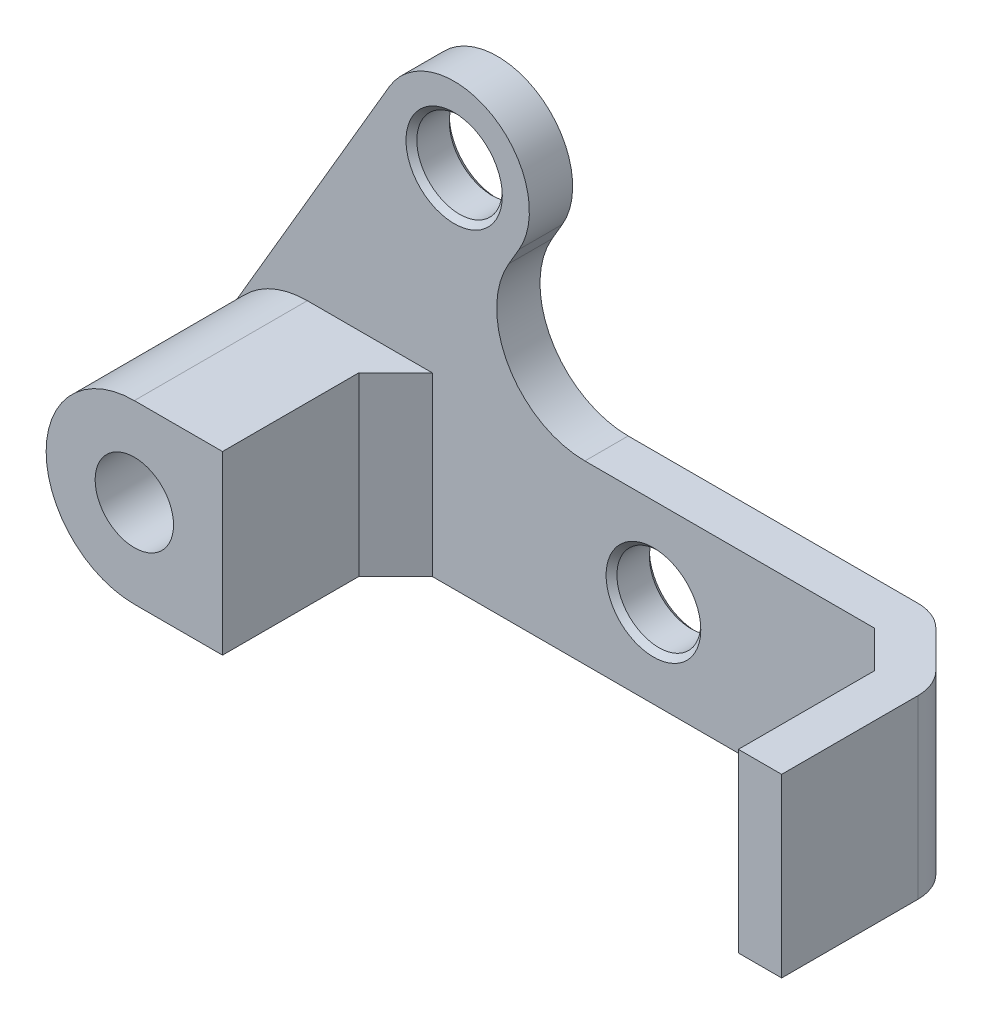
ISO-10303-21;
HEADER;
FILE_DESCRIPTION(('STEP AP214'),'2;1');
FILE_NAME('part.step','',(''),(''),'','','');
FILE_SCHEMA(('AUTOMOTIVE_DESIGN { 1 0 10303 214 1 1 1 1 }'));
ENDSEC;
DATA;
#1=APPLICATION_CONTEXT('core data for automotive mechanical design processes');
#2=APPLICATION_PROTOCOL_DEFINITION('international standard','automotive_design',2000,#1);
#3=PRODUCT_CONTEXT('',#1,'mechanical');
#4=PRODUCT('Part','Part','',(#3));
#5=PRODUCT_RELATED_PRODUCT_CATEGORY('part','',(#4));
#6=PRODUCT_DEFINITION_FORMATION('','',#4);
#7=PRODUCT_DEFINITION_CONTEXT('part definition',#1,'design');
#8=PRODUCT_DEFINITION('design','',#6,#7);
#9=PRODUCT_DEFINITION_SHAPE('','',#8);
#10=(LENGTH_UNIT() NAMED_UNIT(*) SI_UNIT(.MILLI.,.METRE.));
#11=(NAMED_UNIT(*) PLANE_ANGLE_UNIT() SI_UNIT($,.RADIAN.));
#12=(NAMED_UNIT(*) SI_UNIT($,.STERADIAN.) SOLID_ANGLE_UNIT());
#13=UNCERTAINTY_MEASURE_WITH_UNIT(LENGTH_MEASURE(1.E-05),#10,'distance_accuracy_value','');
#14=(GEOMETRIC_REPRESENTATION_CONTEXT(3) GLOBAL_UNCERTAINTY_ASSIGNED_CONTEXT((#13)) GLOBAL_UNIT_ASSIGNED_CONTEXT((#10,
#11,#12)) REPRESENTATION_CONTEXT('',''));
#15=CARTESIAN_POINT('',(0.,0.,0.));
#16=DIRECTION('',(0.,0.,1.));
#17=DIRECTION('',(1.,0.,0.));
#18=AXIS2_PLACEMENT_3D('',#15,#16,#17);
#19=CARTESIAN_POINT('',(86.3209999999999,39.3505000000001,0.));
#20=DIRECTION('',(0.,1.,0.));
#21=DIRECTION('',(-1.,0.,0.));
#22=AXIS2_PLACEMENT_3D('',#19,#20,#21);
#23=PLANE('',#22);
#24=DIRECTION('',(-1.,0.,0.));
#25=VECTOR('',#24,1.);
#26=CARTESIAN_POINT('',(86.3209999999999,39.3505000000001,25.3840000000001));
#27=LINE('',#26,#25);
#28=CARTESIAN_POINT('',(86.3209999999999,39.3505000000001,25.3840000000001));
#29=VERTEX_POINT('',#28);
#30=CARTESIAN_POINT('',(81.2409999999999,39.3505000000001,25.3840000000001));
#31=VERTEX_POINT('',#30);
#32=EDGE_CURVE('E193',#29,#31,#27,.T.);
#33=ORIENTED_EDGE('',*,*,#32,.F.);
#34=DIRECTION('',(0.,0.,1.));
#35=VECTOR('',#34,1.);
#36=CARTESIAN_POINT('',(86.3210000000002,39.3505000000001,0.));
#37=LINE('',#36,#35);
#38=CARTESIAN_POINT('',(86.3210000000002,39.3505000000001,9.39052293811297));
#39=VERTEX_POINT('',#38);
#40=EDGE_CURVE('E192',#29,#39,#37,.F.);
#41=ORIENTED_EDGE('',*,*,#40,.T.);
#42=CARTESIAN_POINT('',(81.2409999999999,39.3505000000001,9.39052293811297));
#43=DIRECTION('',(0.,1.,0.));
#44=DIRECTION('',(-1.,0.,0.));
#45=AXIS2_PLACEMENT_3D('',#42,#43,#44);
#46=CIRCLE('',#45,5.08);
#47=CARTESIAN_POINT('',(84.8331024484276,39.3505000000001,5.79842048968529));
#48=VERTEX_POINT('',#47);
#49=EDGE_CURVE('E813',#39,#48,#46,.T.);
#50=ORIENTED_EDGE('',*,*,#49,.T.);
#51=DIRECTION('',(-0.707106781186567,0.,-0.707106781186528));
#52=VECTOR('',#51,1.);
#53=CARTESIAN_POINT('',(84.8331024484278,39.3505000000001,5.79842048968551));
#54=LINE('',#53,#52);
#55=CARTESIAN_POINT('',(80.5225795103145,39.3505000000001,1.48789755157245));
#56=VERTEX_POINT('',#55);
#57=EDGE_CURVE('E361',#48,#56,#54,.T.);
#58=ORIENTED_EDGE('',*,*,#57,.T.);
#59=CARTESIAN_POINT('',(76.930477061887,39.3505000000001,5.08));
#60=DIRECTION('',(0.,1.,0.));
#61=DIRECTION('',(-1.,0.,0.));
#62=AXIS2_PLACEMENT_3D('',#59,#60,#61);
#63=CIRCLE('',#62,5.08);
#64=CARTESIAN_POINT('',(76.930477061887,39.3505000000001,0.));
#65=VERTEX_POINT('',#64);
#66=EDGE_CURVE('E733',#56,#65,#63,.T.);
#67=ORIENTED_EDGE('',*,*,#66,.T.);
#68=DIRECTION('',(1.,0.,0.));
#69=VECTOR('',#68,1.);
#70=CARTESIAN_POINT('',(43.1605000000001,39.3505000000001,0.));
#71=LINE('',#70,#69);
#72=CARTESIAN_POINT('',(42.9251677598156,39.3505000000001,0.));
#73=VERTEX_POINT('',#72);
#74=EDGE_CURVE('E215',#65,#73,#71,.F.);
#75=ORIENTED_EDGE('',*,*,#74,.T.);
#76=DIRECTION('',(0.,0.,1.));
#77=VECTOR('',#76,1.);
#78=CARTESIAN_POINT('',(42.9251677598156,39.3505000000001,0.));
#79=LINE('',#78,#77);
#80=CARTESIAN_POINT('',(42.9251677598156,39.3505000000001,5.08));
#81=VERTEX_POINT('',#80);
#82=EDGE_CURVE('E354',#73,#81,#79,.T.);
#83=ORIENTED_EDGE('',*,*,#82,.T.);
#84=DIRECTION('',(-1.,0.,0.));
#85=VECTOR('',#84,1.);
#86=CARTESIAN_POINT('',(86.3209999999999,39.3505000000001,5.08));
#87=LINE('',#86,#85);
#88=CARTESIAN_POINT('',(76.9304770618867,39.3505000000001,5.08));
#89=VERTEX_POINT('',#88);
#90=EDGE_CURVE('E360',#81,#89,#87,.F.);
#91=ORIENTED_EDGE('',*,*,#90,.T.);
#92=DIRECTION('',(-0.707106781186539,0.,-0.707106781186556));
#93=VECTOR('',#92,1.);
#94=CARTESIAN_POINT('',(81.2409999999999,39.3505000000001,9.39052293811325));
#95=LINE('',#94,#93);
#96=CARTESIAN_POINT('',(81.2409999999999,39.3505000000001,9.39052293811325));
#97=VERTEX_POINT('',#96);
#98=EDGE_CURVE('E805',#89,#97,#95,.F.);
#99=ORIENTED_EDGE('',*,*,#98,.T.);
#100=DIRECTION('',(0.,0.,1.));
#101=VECTOR('',#100,1.);
#102=CARTESIAN_POINT('',(81.2409999999999,39.3505000000001,0.));
#103=LINE('',#102,#101);
#104=EDGE_CURVE('E588',#97,#31,#103,.T.);
#105=ORIENTED_EDGE('',*,*,#104,.T.);
#106=EDGE_LOOP('',(#33,#41,#50,#58,#67,#75,#83,#91,#99,#105));
#107=FACE_BOUND('',#106,.T.);
#108=ADVANCED_FACE('F50',(#107),#23,.T.);
#109=CARTESIAN_POINT('',(43.1605000000001,29.0000000000001,0.));
#110=DIRECTION('',(0.,0.,1.));
#111=DIRECTION('',(1.,0.,0.));
#112=AXIS2_PLACEMENT_3D('',#109,#110,#111);
#113=PLANE('',#112);
#114=CARTESIAN_POINT('',(10.3505,29.0000000000001,0.));
#115=DIRECTION('',(0.,0.,1.));
#116=DIRECTION('',(1.,0.,0.));
#117=AXIS2_PLACEMENT_3D('',#114,#115,#116);
#118=CIRCLE('',#117,7.17549999999999);
#119=CARTESIAN_POINT('',(17.526,29.0000000000001,0.));
#120=VERTEX_POINT('',#119);
#121=EDGE_CURVE('E538',#120,#120,#118,.T.);
#122=ORIENTED_EDGE('',*,*,#121,.T.);
#123=EDGE_LOOP('',(#122));
#124=FACE_BOUND('',#123,.T.);
#125=CARTESIAN_POINT('',(27.580941262364,61.4484999999991,0.));
#126=DIRECTION('',(0.,0.,1.));
#127=DIRECTION('',(1.,0.,0.));
#128=AXIS2_PLACEMENT_3D('',#125,#126,#127);
#129=CIRCLE('',#128,5.6514999999844);
#130=CARTESIAN_POINT('',(33.2324412623484,61.4484999999991,0.));
#131=VERTEX_POINT('',#130);
#132=EDGE_CURVE('E531',#131,#131,#129,.T.);
#133=ORIENTED_EDGE('',*,*,#132,.T.);
#134=EDGE_LOOP('',(#133));
#135=FACE_BOUND('',#134,.T.);
#136=CARTESIAN_POINT('',(50.9710000000001,29.0000000000001,0.));
#137=DIRECTION('',(0.,0.,1.));
#138=DIRECTION('',(1.,0.,0.));
#139=AXIS2_PLACEMENT_3D('',#136,#137,#138);
#140=CIRCLE('',#139,5.55624999998435);
#141=CARTESIAN_POINT('',(56.5272499999844,29.0000000000001,0.));
#142=VERTEX_POINT('',#141);
#143=EDGE_CURVE('E527',#142,#142,#140,.T.);
#144=ORIENTED_EDGE('',*,*,#143,.T.);
#145=EDGE_LOOP('',(#144));
#146=FACE_BOUND('',#145,.T.);
#147=ORIENTED_EDGE('',*,*,#74,.F.);
#148=DIRECTION('',(0.,1.,0.));
#149=VECTOR('',#148,1.);
#150=CARTESIAN_POINT('',(76.930477061887,29.0000000000001,0.));
#151=LINE('',#150,#149);
#152=CARTESIAN_POINT('',(76.930477061887,18.6495,0.));
#153=VERTEX_POINT('',#152);
#154=EDGE_CURVE('E12',#65,#153,#151,.F.);
#155=ORIENTED_EDGE('',*,*,#154,.T.);
#156=DIRECTION('',(1.,0.,0.));
#157=VECTOR('',#156,1.);
#158=CARTESIAN_POINT('',(43.1605000000001,18.6495,0.));
#159=LINE('',#158,#157);
#160=CARTESIAN_POINT('',(10.3505,18.6495,0.));
#161=VERTEX_POINT('',#160);
#162=EDGE_CURVE('E261',#161,#153,#159,.T.);
#163=ORIENTED_EDGE('',*,*,#162,.F.);
#164=CARTESIAN_POINT('',(10.3505,29.0000000000001,0.));
#165=DIRECTION('',(0.,0.,1.));
#166=DIRECTION('',(1.,0.,0.));
#167=AXIS2_PLACEMENT_3D('',#164,#165,#166);
#168=CIRCLE('',#167,10.3505);
#169=CARTESIAN_POINT('',(1.4181269699782,34.2292984522342,0.));
#170=VERTEX_POINT('',#169);
#171=EDGE_CURVE('E259',#170,#161,#168,.T.);
#172=ORIENTED_EDGE('',*,*,#171,.F.);
#173=DIRECTION('',(-0.505221820417778,-0.862989520315135,0.));
#174=VECTOR('',#173,1.);
#175=CARTESIAN_POINT('',(19.9637642613026,65.9078403979164,0.));
#176=LINE('',#175,#174);
#177=CARTESIAN_POINT('',(19.9637642613026,65.9078403979164,0.));
#178=VERTEX_POINT('',#177);
#179=EDGE_CURVE('E254',#178,#170,#176,.T.);
#180=ORIENTED_EDGE('',*,*,#179,.F.);
#181=CARTESIAN_POINT('',(27.580941262364,61.4484999999991,0.));
#182=DIRECTION('',(0.,0.,1.));
#183=DIRECTION('',(1.,0.,0.));
#184=AXIS2_PLACEMENT_3D('',#181,#182,#183);
#185=CIRCLE('',#184,8.82649999999982);
#186=CARTESIAN_POINT('',(35.1981182634254,56.9891596020816,0.));
#187=VERTEX_POINT('',#186);
#188=EDGE_CURVE('E260',#187,#178,#185,.T.);
#189=ORIENTED_EDGE('',*,*,#188,.F.);
#190=DIRECTION('',(0.505221820417766,0.862989520315142,0.));
#191=VECTOR('',#190,1.);
#192=CARTESIAN_POINT('',(33.9927947297937,54.9302984522342,0.));
#193=LINE('',#192,#191);
#194=CARTESIAN_POINT('',(33.9927947297937,54.9302984522342,0.));
#195=VERTEX_POINT('',#194);
#196=EDGE_CURVE('E264',#195,#187,#193,.T.);
#197=ORIENTED_EDGE('',*,*,#196,.F.);
#198=CARTESIAN_POINT('',(42.9251677598156,49.7010000000001,0.));
#199=DIRECTION('',(0.,0.,1.));
#200=DIRECTION('',(1.,0.,0.));
#201=AXIS2_PLACEMENT_3D('',#198,#199,#200);
#202=CIRCLE('',#201,10.3505);
#203=EDGE_CURVE('E281',#73,#195,#202,.F.);
#204=ORIENTED_EDGE('',*,*,#203,.F.);
#205=EDGE_LOOP('',(#147,#155,#163,#172,#180,#189,#197,#204));
#206=FACE_BOUND('',#205,.T.);
#207=ADVANCED_FACE('F612',(#124,#135,#146,#206),#113,.F.);
#208=CARTESIAN_POINT('',(84.8331024484278,39.3505000000001,5.79842048968556));
#209=DIRECTION('',(-0.707106781186549,0.,0.707106781186546));
#210=DIRECTION('',(0.707106781186546,0.,0.707106781186549));
#211=AXIS2_PLACEMENT_3D('',#208,#209,#210);
#212=PLANE('',#211);
#213=ORIENTED_EDGE('',*,*,#57,.F.);
#214=DIRECTION('',(0.,1.,0.));
#215=VECTOR('',#214,1.);
#216=CARTESIAN_POINT('',(84.8331024484276,18.6495,5.7984204896853));
#217=LINE('',#216,#215);
#218=CARTESIAN_POINT('',(84.8331024484276,18.6495,5.79842048968527));
#219=VERTEX_POINT('',#218);
#220=EDGE_CURVE('E60',#48,#219,#217,.F.);
#221=ORIENTED_EDGE('',*,*,#220,.T.);
#222=DIRECTION('',(0.707106781186567,0.,0.707106781186528));
#223=VECTOR('',#222,1.);
#224=CARTESIAN_POINT('',(80.5225795103144,18.6495,1.48789755157233));
#225=LINE('',#224,#223);
#226=CARTESIAN_POINT('',(80.5225795103145,18.6495,1.48789755157245));
#227=VERTEX_POINT('',#226);
#228=EDGE_CURVE('E201',#227,#219,#225,.T.);
#229=ORIENTED_EDGE('',*,*,#228,.F.);
#230=DIRECTION('',(0.,1.,0.));
#231=VECTOR('',#230,1.);
#232=CARTESIAN_POINT('',(80.5225795103146,39.3505000000001,1.48789755157234));
#233=LINE('',#232,#231);
#234=EDGE_CURVE('E836',#227,#56,#233,.T.);
#235=ORIENTED_EDGE('',*,*,#234,.T.);
#236=EDGE_LOOP('',(#213,#221,#229,#235));
#237=FACE_BOUND('',#236,.T.);
#238=ADVANCED_FACE('F641',(#237),#212,.F.);
#239=CARTESIAN_POINT('',(86.3209999999999,18.6495,0.));
#240=DIRECTION('',(1.,0.,0.));
#241=DIRECTION('',(0.,1.,0.));
#242=AXIS2_PLACEMENT_3D('',#239,#240,#241);
#243=PLANE('',#242);
#244=DIRECTION('',(0.,1.,0.));
#245=VECTOR('',#244,1.);
#246=CARTESIAN_POINT('',(86.3209999999999,18.6495,25.3840000000001));
#247=LINE('',#246,#245);
#248=CARTESIAN_POINT('',(86.3209999999999,18.6495,25.3840000000001));
#249=VERTEX_POINT('',#248);
#250=EDGE_CURVE('E177',#249,#29,#247,.T.);
#251=ORIENTED_EDGE('',*,*,#250,.F.);
#252=DIRECTION('',(0.,0.,1.));
#253=VECTOR('',#252,1.);
#254=CARTESIAN_POINT('',(86.3209999999999,18.6495,0.));
#255=LINE('',#254,#253);
#256=CARTESIAN_POINT('',(86.3209999999999,18.6495,9.39052293811295));
#257=VERTEX_POINT('',#256);
#258=EDGE_CURVE('E190',#257,#249,#255,.T.);
#259=ORIENTED_EDGE('',*,*,#258,.F.);
#260=DIRECTION('',(0.,1.,0.));
#261=VECTOR('',#260,1.);
#262=CARTESIAN_POINT('',(86.3209999999999,39.3505000000001,9.39052293811297));
#263=LINE('',#262,#261);
#264=EDGE_CURVE('E815',#257,#39,#263,.T.);
#265=ORIENTED_EDGE('',*,*,#264,.T.);
#266=ORIENTED_EDGE('',*,*,#40,.F.);
#267=EDGE_LOOP('',(#251,#259,#265,#266));
#268=FACE_BOUND('',#267,.T.);
#269=ADVANCED_FACE('F188',(#268),#243,.T.);
#270=CARTESIAN_POINT('',(20.701,18.6495,5.08));
#271=DIRECTION('',(1.,0.,0.));
#272=DIRECTION('',(0.,0.,-1.));
#273=AXIS2_PLACEMENT_3D('',#270,#271,#272);
#274=PLANE('',#273);
#275=DIRECTION('',(0.,1.,0.));
#276=VECTOR('',#275,1.);
#277=CARTESIAN_POINT('',(20.701,18.6495,25.3840000000001));
#278=LINE('',#277,#276);
#279=CARTESIAN_POINT('',(20.701,18.6495,25.3840000000001));
#280=VERTEX_POINT('',#279);
#281=CARTESIAN_POINT('',(20.701,39.3505000000001,25.3840000000001));
#282=VERTEX_POINT('',#281);
#283=EDGE_CURVE('E543',#280,#282,#278,.T.);
#284=ORIENTED_EDGE('',*,*,#283,.F.);
#285=DIRECTION('',(0.,0.,1.));
#286=VECTOR('',#285,1.);
#287=CARTESIAN_POINT('',(20.701,18.6495,0.));
#288=LINE('',#287,#286);
#289=CARTESIAN_POINT('',(20.701,18.6495,9.39052293811317));
#290=VERTEX_POINT('',#289);
#291=EDGE_CURVE('E200',#290,#280,#288,.T.);
#292=ORIENTED_EDGE('',*,*,#291,.F.);
#293=DIRECTION('',(0.,1.,0.));
#294=VECTOR('',#293,1.);
#295=CARTESIAN_POINT('',(20.701,39.3505000000001,9.39052293811317));
#296=LINE('',#295,#294);
#297=CARTESIAN_POINT('',(20.701,39.3505000000001,9.39052293811317));
#298=VERTEX_POINT('',#297);
#299=EDGE_CURVE('E581',#290,#298,#296,.T.);
#300=ORIENTED_EDGE('',*,*,#299,.T.);
#301=DIRECTION('',(0.,0.,1.));
#302=VECTOR('',#301,1.);
#303=CARTESIAN_POINT('',(20.701,39.3505000000001,0.));
#304=LINE('',#303,#302);
#305=EDGE_CURVE('E54',#282,#298,#304,.F.);
#306=ORIENTED_EDGE('',*,*,#305,.F.);
#307=EDGE_LOOP('',(#284,#292,#300,#306));
#308=FACE_BOUND('',#307,.T.);
#309=ADVANCED_FACE('F668',(#308),#274,.T.);
#310=CARTESIAN_POINT('',(81.2409999999999,39.3505000000001,5.08));
#311=DIRECTION('',(-1.,0.,0.));
#312=DIRECTION('',(0.,0.,1.));
#313=AXIS2_PLACEMENT_3D('',#310,#311,#312);
#314=PLANE('',#313);
#315=DIRECTION('',(0.,-1.,0.));
#316=VECTOR('',#315,1.);
#317=CARTESIAN_POINT('',(81.2409999999999,39.3505000000001,25.3840000000001));
#318=LINE('',#317,#316);
#319=CARTESIAN_POINT('',(81.2409999999999,18.6495,25.3840000000001));
#320=VERTEX_POINT('',#319);
#321=EDGE_CURVE('E76',#31,#320,#318,.T.);
#322=ORIENTED_EDGE('',*,*,#321,.F.);
#323=ORIENTED_EDGE('',*,*,#104,.F.);
#324=DIRECTION('',(0.,-1.,0.));
#325=VECTOR('',#324,1.);
#326=CARTESIAN_POINT('',(81.2409999999999,18.6495,9.39052293811325));
#327=LINE('',#326,#325);
#328=CARTESIAN_POINT('',(81.2409999999999,18.6495,9.39052293811325));
#329=VERTEX_POINT('',#328);
#330=EDGE_CURVE('E587',#97,#329,#327,.T.);
#331=ORIENTED_EDGE('',*,*,#330,.T.);
#332=DIRECTION('',(0.,0.,1.));
#333=VECTOR('',#332,1.);
#334=CARTESIAN_POINT('',(81.2409999999999,18.6495,0.));
#335=LINE('',#334,#333);
#336=EDGE_CURVE('E208',#320,#329,#335,.F.);
#337=ORIENTED_EDGE('',*,*,#336,.F.);
#338=EDGE_LOOP('',(#322,#323,#331,#337));
#339=FACE_BOUND('',#338,.T.);
#340=ADVANCED_FACE('F743',(#339),#314,.T.);
#341=CARTESIAN_POINT('',(43.1605000000001,29.0000000000001,5.08));
#342=DIRECTION('',(0.,0.,1.));
#343=DIRECTION('',(1.,0.,0.));
#344=AXIS2_PLACEMENT_3D('',#341,#342,#343);
#345=PLANE('',#344);
#346=CARTESIAN_POINT('',(50.9710000000001,29.0000000000001,5.08));
#347=DIRECTION('',(0.,0.,1.));
#348=DIRECTION('',(1.,0.,0.));
#349=AXIS2_PLACEMENT_3D('',#346,#347,#348);
#350=CIRCLE('',#349,5.55624999998438);
#351=CARTESIAN_POINT('',(56.5272499999845,29.0000000000001,5.08));
#352=VERTEX_POINT('',#351);
#353=EDGE_CURVE('E524',#352,#352,#350,.F.);
#354=ORIENTED_EDGE('',*,*,#353,.T.);
#355=EDGE_LOOP('',(#354));
#356=FACE_BOUND('',#355,.T.);
#357=CARTESIAN_POINT('',(27.580941262364,61.4484999999991,5.08));
#358=DIRECTION('',(0.,0.,1.));
#359=DIRECTION('',(1.,0.,0.));
#360=AXIS2_PLACEMENT_3D('',#357,#358,#359);
#361=CIRCLE('',#360,5.65149999998442);
#362=CARTESIAN_POINT('',(33.2324412623484,61.4484999999991,5.08));
#363=VERTEX_POINT('',#362);
#364=EDGE_CURVE('E520',#363,#363,#361,.F.);
#365=ORIENTED_EDGE('',*,*,#364,.T.);
#366=EDGE_LOOP('',(#365));
#367=FACE_BOUND('',#366,.T.);
#368=DIRECTION('',(-1.,0.,0.));
#369=VECTOR('',#368,1.);
#370=CARTESIAN_POINT('',(86.3209999999999,39.3505000000001,5.08));
#371=LINE('',#370,#369);
#372=CARTESIAN_POINT('',(25.0115229381132,39.3505000000001,5.08));
#373=VERTEX_POINT('',#372);
#374=CARTESIAN_POINT('',(10.3505,39.3505000000001,5.08));
#375=VERTEX_POINT('',#374);
#376=EDGE_CURVE('E391',#373,#375,#371,.T.);
#377=ORIENTED_EDGE('',*,*,#376,.F.);
#378=DIRECTION('',(0.,-1.,0.));
#379=VECTOR('',#378,1.);
#380=CARTESIAN_POINT('',(25.0115229381132,18.6495,5.08));
#381=LINE('',#380,#379);
#382=CARTESIAN_POINT('',(25.0115229381132,18.6495,5.08));
#383=VERTEX_POINT('',#382);
#384=EDGE_CURVE('E584',#373,#383,#381,.T.);
#385=ORIENTED_EDGE('',*,*,#384,.T.);
#386=DIRECTION('',(1.,0.,0.));
#387=VECTOR('',#386,1.);
#388=CARTESIAN_POINT('',(10.3505,18.6495,5.08));
#389=LINE('',#388,#387);
#390=CARTESIAN_POINT('',(76.9304770618867,18.6495,5.08));
#391=VERTEX_POINT('',#390);
#392=EDGE_CURVE('E576',#391,#383,#389,.F.);
#393=ORIENTED_EDGE('',*,*,#392,.F.);
#394=DIRECTION('',(0.,1.,0.));
#395=VECTOR('',#394,1.);
#396=CARTESIAN_POINT('',(76.9304770618867,39.3505000000001,5.08));
#397=LINE('',#396,#395);
#398=EDGE_CURVE('E582',#391,#89,#397,.T.);
#399=ORIENTED_EDGE('',*,*,#398,.T.);
#400=ORIENTED_EDGE('',*,*,#90,.F.);
#401=CARTESIAN_POINT('',(42.9251677598156,49.7010000000001,5.08));
#402=DIRECTION('',(0.,0.,1.));
#403=DIRECTION('',(1.,0.,0.));
#404=AXIS2_PLACEMENT_3D('',#401,#402,#403);
#405=CIRCLE('',#404,10.3505);
#406=CARTESIAN_POINT('',(33.9927947297938,54.9302984522342,5.08));
#407=VERTEX_POINT('',#406);
#408=EDGE_CURVE('E547',#81,#407,#405,.F.);
#409=ORIENTED_EDGE('',*,*,#408,.T.);
#410=DIRECTION('',(0.505221820417777,0.862989520315135,0.));
#411=VECTOR('',#410,1.);
#412=CARTESIAN_POINT('',(33.9927947297937,54.9302984522342,5.08));
#413=LINE('',#412,#411);
#414=CARTESIAN_POINT('',(35.1981182634254,56.9891596020815,5.08));
#415=VERTEX_POINT('',#414);
#416=EDGE_CURVE('E553',#415,#407,#413,.F.);
#417=ORIENTED_EDGE('',*,*,#416,.F.);
#418=CARTESIAN_POINT('',(27.580941262364,61.4484999999991,5.08));
#419=DIRECTION('',(0.,0.,1.));
#420=DIRECTION('',(1.,0.,0.));
#421=AXIS2_PLACEMENT_3D('',#418,#419,#420);
#422=CIRCLE('',#421,8.82649999999982);
#423=CARTESIAN_POINT('',(19.9637642613026,65.9078403979164,5.08));
#424=VERTEX_POINT('',#423);
#425=EDGE_CURVE('E392',#424,#415,#422,.F.);
#426=ORIENTED_EDGE('',*,*,#425,.F.);
#427=DIRECTION('',(-0.505221820417778,-0.862989520315135,0.));
#428=VECTOR('',#427,1.);
#429=CARTESIAN_POINT('',(19.9637642613026,65.9078403979164,5.08));
#430=LINE('',#429,#428);
#431=CARTESIAN_POINT('',(1.4181269699782,34.2292984522342,5.08));
#432=VERTEX_POINT('',#431);
#433=EDGE_CURVE('E364',#432,#424,#430,.F.);
#434=ORIENTED_EDGE('',*,*,#433,.F.);
#435=CARTESIAN_POINT('',(10.3505,29.0000000000001,5.08));
#436=DIRECTION('',(0.,0.,1.));
#437=DIRECTION('',(1.,0.,0.));
#438=AXIS2_PLACEMENT_3D('',#435,#436,#437);
#439=CIRCLE('',#438,10.3505);
#440=EDGE_CURVE('E386',#375,#432,#439,.T.);
#441=ORIENTED_EDGE('',*,*,#440,.F.);
#442=EDGE_LOOP('',(#377,#385,#393,#399,#400,#409,#417,#426,#434,#441));
#443=FACE_BOUND('',#442,.T.);
#444=ADVANCED_FACE('F685',(#356,#367,#443),#345,.T.);
#445=CARTESIAN_POINT('',(42.9251677598156,49.7010000000001,0.));
#446=DIRECTION('',(0.,0.,1.));
#447=DIRECTION('',(1.,0.,0.));
#448=AXIS2_PLACEMENT_3D('',#445,#446,#447);
#449=CYLINDRICAL_SURFACE('',#448,10.3505);
#450=DIRECTION('',(0.,0.,1.));
#451=VECTOR('',#450,1.);
#452=CARTESIAN_POINT('',(33.9927947297937,54.9302984522342,0.));
#453=LINE('',#452,#451);
#454=EDGE_CURVE('E362',#407,#195,#453,.F.);
#455=ORIENTED_EDGE('',*,*,#454,.F.);
#456=ORIENTED_EDGE('',*,*,#408,.F.);
#457=ORIENTED_EDGE('',*,*,#82,.F.);
#458=ORIENTED_EDGE('',*,*,#203,.T.);
#459=EDGE_LOOP('',(#455,#456,#457,#458));
#460=FACE_BOUND('',#459,.T.);
#461=ADVANCED_FACE('F735',(#460),#449,.F.);
#462=CARTESIAN_POINT('',(33.9927947297937,54.9302984522342,0.));
#463=DIRECTION('',(0.862989520315135,-0.505221820417777,0.));
#464=DIRECTION('',(0.505221820417777,0.862989520315135,0.));
#465=AXIS2_PLACEMENT_3D('',#462,#463,#464);
#466=PLANE('',#465);
#467=ORIENTED_EDGE('',*,*,#416,.T.);
#468=ORIENTED_EDGE('',*,*,#454,.T.);
#469=ORIENTED_EDGE('',*,*,#196,.T.);
#470=DIRECTION('',(0.,0.,1.));
#471=VECTOR('',#470,1.);
#472=CARTESIAN_POINT('',(35.1981182634253,56.9891596020815,0.));
#473=LINE('',#472,#471);
#474=EDGE_CURVE('E703',#415,#187,#473,.F.);
#475=ORIENTED_EDGE('',*,*,#474,.F.);
#476=EDGE_LOOP('',(#467,#468,#469,#475));
#477=FACE_BOUND('',#476,.T.);
#478=ADVANCED_FACE('F715',(#477),#466,.T.);
#479=CARTESIAN_POINT('',(27.580941262364,61.4484999999991,0.));
#480=DIRECTION('',(0.,0.,1.));
#481=DIRECTION('',(1.,0.,0.));
#482=AXIS2_PLACEMENT_3D('',#479,#480,#481);
#483=CYLINDRICAL_SURFACE('',#482,8.82649999999982);
#484=ORIENTED_EDGE('',*,*,#425,.T.);
#485=ORIENTED_EDGE('',*,*,#474,.T.);
#486=ORIENTED_EDGE('',*,*,#188,.T.);
#487=DIRECTION('',(0.,0.,1.));
#488=VECTOR('',#487,1.);
#489=CARTESIAN_POINT('',(19.9637642613026,65.9078403979164,0.));
#490=LINE('',#489,#488);
#491=EDGE_CURVE('E701',#424,#178,#490,.F.);
#492=ORIENTED_EDGE('',*,*,#491,.F.);
#493=EDGE_LOOP('',(#484,#485,#486,#492));
#494=FACE_BOUND('',#493,.T.);
#495=ADVANCED_FACE('F656',(#494),#483,.T.);
#496=CARTESIAN_POINT('',(19.9637642613026,65.9078403979164,0.));
#497=DIRECTION('',(-0.862989520315135,0.505221820417778,0.));
#498=DIRECTION('',(-0.505221820417778,-0.862989520315135,0.));
#499=AXIS2_PLACEMENT_3D('',#496,#497,#498);
#500=PLANE('',#499);
#501=ORIENTED_EDGE('',*,*,#433,.T.);
#502=ORIENTED_EDGE('',*,*,#491,.T.);
#503=ORIENTED_EDGE('',*,*,#179,.T.);
#504=DIRECTION('',(0.,0.,1.));
#505=VECTOR('',#504,1.);
#506=CARTESIAN_POINT('',(1.41812696997815,34.2292984522342,0.));
#507=LINE('',#506,#505);
#508=EDGE_CURVE('E390',#432,#170,#507,.F.);
#509=ORIENTED_EDGE('',*,*,#508,.F.);
#510=EDGE_LOOP('',(#501,#502,#503,#509));
#511=FACE_BOUND('',#510,.T.);
#512=ADVANCED_FACE('F648',(#511),#500,.T.);
#513=CARTESIAN_POINT('',(10.3505,39.3505000000001,25.3840000000001));
#514=VERTEX_POINT('',#513);
#515=EDGE_CURVE('E660',#282,#514,#27,.T.);
#516=ORIENTED_EDGE('',*,*,#515,.F.);
#517=ORIENTED_EDGE('',*,*,#305,.T.);
#518=DIRECTION('',(-0.707106781186554,0.,0.707106781186541));
#519=VECTOR('',#518,1.);
#520=CARTESIAN_POINT('',(25.0115229381132,39.3505000000001,5.08));
#521=LINE('',#520,#519);
#522=EDGE_CURVE('E682',#298,#373,#521,.F.);
#523=ORIENTED_EDGE('',*,*,#522,.T.);
#524=ORIENTED_EDGE('',*,*,#376,.T.);
#525=DIRECTION('',(0.,0.,1.));
#526=VECTOR('',#525,1.);
#527=CARTESIAN_POINT('',(10.3505,39.3505000000001,0.));
#528=LINE('',#527,#526);
#529=EDGE_CURVE('E470',#514,#375,#528,.F.);
#530=ORIENTED_EDGE('',*,*,#529,.F.);
#531=EDGE_LOOP('',(#516,#517,#523,#524,#530));
#532=FACE_BOUND('',#531,.T.);
#533=ADVANCED_FACE('F635',(#532),#23,.T.);
#534=CARTESIAN_POINT('',(10.3505,29.0000000000001,0.));
#535=DIRECTION('',(0.,0.,1.));
#536=DIRECTION('',(1.,0.,0.));
#537=AXIS2_PLACEMENT_3D('',#534,#535,#536);
#538=CYLINDRICAL_SURFACE('',#537,10.3505);
#539=CARTESIAN_POINT('',(10.3505,29.0000000000001,25.3840000000001));
#540=DIRECTION('',(0.,0.,-1.));
#541=DIRECTION('',(-1.,0.,0.));
#542=AXIS2_PLACEMENT_3D('',#539,#540,#541);
#543=CIRCLE('',#542,10.3505);
#544=CARTESIAN_POINT('',(10.3505,18.6495,25.3840000000001));
#545=VERTEX_POINT('',#544);
#546=EDGE_CURVE('E68',#514,#545,#543,.F.);
#547=ORIENTED_EDGE('',*,*,#546,.F.);
#548=ORIENTED_EDGE('',*,*,#529,.T.);
#549=ORIENTED_EDGE('',*,*,#440,.T.);
#550=ORIENTED_EDGE('',*,*,#508,.T.);
#551=ORIENTED_EDGE('',*,*,#171,.T.);
#552=DIRECTION('',(0.,0.,1.));
#553=VECTOR('',#552,1.);
#554=CARTESIAN_POINT('',(10.3505,18.6495,0.));
#555=LINE('',#554,#553);
#556=EDGE_CURVE('E211',#545,#161,#555,.F.);
#557=ORIENTED_EDGE('',*,*,#556,.F.);
#558=EDGE_LOOP('',(#547,#548,#549,#550,#551,#557));
#559=FACE_BOUND('',#558,.T.);
#560=ADVANCED_FACE('F647',(#559),#538,.T.);
#561=CARTESIAN_POINT('',(10.3505,18.6495,0.));
#562=DIRECTION('',(0.,-1.,0.));
#563=DIRECTION('',(1.,0.,0.));
#564=AXIS2_PLACEMENT_3D('',#561,#562,#563);
#565=PLANE('',#564);
#566=DIRECTION('',(1.,0.,0.));
#567=VECTOR('',#566,1.);
#568=CARTESIAN_POINT('',(10.3505,18.6495,25.3840000000001));
#569=LINE('',#568,#567);
#570=EDGE_CURVE('E184',#545,#280,#569,.T.);
#571=ORIENTED_EDGE('',*,*,#570,.F.);
#572=ORIENTED_EDGE('',*,*,#556,.T.);
#573=ORIENTED_EDGE('',*,*,#162,.T.);
#574=CARTESIAN_POINT('',(76.930477061887,18.6495,5.08));
#575=DIRECTION('',(0.,-1.,0.));
#576=DIRECTION('',(1.,0.,0.));
#577=AXIS2_PLACEMENT_3D('',#574,#575,#576);
#578=CIRCLE('',#577,5.08);
#579=EDGE_CURVE('E817',#153,#227,#578,.T.);
#580=ORIENTED_EDGE('',*,*,#579,.T.);
#581=ORIENTED_EDGE('',*,*,#228,.T.);
#582=CARTESIAN_POINT('',(81.2409999999999,18.6495,9.39052293811295));
#583=DIRECTION('',(0.,-1.,0.));
#584=DIRECTION('',(1.,0.,0.));
#585=AXIS2_PLACEMENT_3D('',#582,#583,#584);
#586=CIRCLE('',#585,5.08);
#587=EDGE_CURVE('E198',#219,#257,#586,.T.);
#588=ORIENTED_EDGE('',*,*,#587,.T.);
#589=ORIENTED_EDGE('',*,*,#258,.T.);
#590=EDGE_CURVE('E174',#320,#249,#569,.T.);
#591=ORIENTED_EDGE('',*,*,#590,.F.);
#592=ORIENTED_EDGE('',*,*,#336,.T.);
#593=DIRECTION('',(0.707106781186539,0.,0.707106781186556));
#594=VECTOR('',#593,1.);
#595=CARTESIAN_POINT('',(81.2409999999999,18.6495,9.39052293811325));
#596=LINE('',#595,#594);
#597=EDGE_CURVE('E797',#329,#391,#596,.F.);
#598=ORIENTED_EDGE('',*,*,#597,.T.);
#599=ORIENTED_EDGE('',*,*,#392,.T.);
#600=DIRECTION('',(0.707106781186554,0.,-0.707106781186541));
#601=VECTOR('',#600,1.);
#602=CARTESIAN_POINT('',(25.0115229381132,18.6495,5.08));
#603=LINE('',#602,#601);
#604=EDGE_CURVE('E808',#383,#290,#603,.F.);
#605=ORIENTED_EDGE('',*,*,#604,.T.);
#606=ORIENTED_EDGE('',*,*,#291,.T.);
#607=EDGE_LOOP('',(#571,#572,#573,#580,#581,#588,#589,#591,#592,#598,#599,#605,#606));
#608=FACE_BOUND('',#607,.T.);
#609=ADVANCED_FACE('F195',(#608),#565,.T.);
#610=CARTESIAN_POINT('',(27.580941262364,61.4484999999991,5.08));
#611=DIRECTION('',(0.,0.,1.));
#612=DIRECTION('',(1.,0.,0.));
#613=AXIS2_PLACEMENT_3D('',#610,#611,#612);
#614=CYLINDRICAL_SURFACE('',#613,5.01650000000002);
#615=CARTESIAN_POINT('',(27.580941262364,61.4484999999991,0.63499999998436));
#616=DIRECTION('',(0.,0.,1.));
#617=DIRECTION('',(1.,0.,0.));
#618=AXIS2_PLACEMENT_3D('',#615,#616,#617);
#619=CIRCLE('',#618,5.01650000000002);
#620=CARTESIAN_POINT('',(32.597441262364,61.4484999999991,0.63499999998436));
#621=VERTEX_POINT('',#620);
#622=EDGE_CURVE('E602',#621,#621,#619,.F.);
#623=ORIENTED_EDGE('',*,*,#622,.T.);
#624=EDGE_LOOP('',(#623));
#625=FACE_BOUND('',#624,.T.);
#626=CARTESIAN_POINT('',(27.580941262364,61.4484999999991,4.4450000000156));
#627=DIRECTION('',(0.,0.,1.));
#628=DIRECTION('',(1.,0.,0.));
#629=AXIS2_PLACEMENT_3D('',#626,#627,#628);
#630=CIRCLE('',#629,5.01650000000002);
#631=CARTESIAN_POINT('',(32.597441262364,61.4484999999991,4.4450000000156));
#632=VERTEX_POINT('',#631);
#633=EDGE_CURVE('E604',#632,#632,#630,.T.);
#634=ORIENTED_EDGE('',*,*,#633,.T.);
#635=EDGE_LOOP('',(#634));
#636=FACE_BOUND('',#635,.T.);
#637=ADVANCED_FACE('F755',(#625,#636),#614,.F.);
#638=CARTESIAN_POINT('',(50.9710000000001,29.0000000000001,0.));
#639=DIRECTION('',(0.,0.,-1.));
#640=DIRECTION('',(-1.,0.,0.));
#641=AXIS2_PLACEMENT_3D('',#638,#639,#640);
#642=CYLINDRICAL_SURFACE('',#641,4.92124999999998);
#643=CARTESIAN_POINT('',(50.9710000000001,29.0000000000001,4.44500000001561));
#644=DIRECTION('',(0.,0.,1.));
#645=DIRECTION('',(1.,0.,0.));
#646=AXIS2_PLACEMENT_3D('',#643,#644,#645);
#647=CIRCLE('',#646,4.92124999999998);
#648=CARTESIAN_POINT('',(55.8922500000001,29.0000000000001,4.44500000001561));
#649=VERTEX_POINT('',#648);
#650=EDGE_CURVE('E515',#649,#649,#647,.T.);
#651=ORIENTED_EDGE('',*,*,#650,.T.);
#652=EDGE_LOOP('',(#651));
#653=FACE_BOUND('',#652,.T.);
#654=CARTESIAN_POINT('',(50.9710000000001,29.0000000000001,0.634999999984367));
#655=DIRECTION('',(0.,0.,1.));
#656=DIRECTION('',(1.,0.,0.));
#657=AXIS2_PLACEMENT_3D('',#654,#655,#656);
#658=CIRCLE('',#657,4.92124999999998);
#659=CARTESIAN_POINT('',(55.8922500000001,29.0000000000001,0.634999999984367));
#660=VERTEX_POINT('',#659);
#661=EDGE_CURVE('E521',#660,#660,#658,.F.);
#662=ORIENTED_EDGE('',*,*,#661,.T.);
#663=EDGE_LOOP('',(#662));
#664=FACE_BOUND('',#663,.T.);
#665=ADVANCED_FACE('F628',(#653,#664),#642,.F.);
#666=CARTESIAN_POINT('',(50.9710000000001,29.0000000000001,4.44500000001561));
#667=DIRECTION('',(0.,0.,1.));
#668=DIRECTION('',(1.,0.,0.));
#669=AXIS2_PLACEMENT_3D('',#666,#667,#668);
#670=CONICAL_SURFACE('',#669,4.92124999999998,0.785398163397454);
#671=ORIENTED_EDGE('',*,*,#353,.F.);
#672=EDGE_LOOP('',(#671));
#673=FACE_BOUND('',#672,.T.);
#674=ORIENTED_EDGE('',*,*,#650,.F.);
#675=EDGE_LOOP('',(#674));
#676=FACE_BOUND('',#675,.T.);
#677=ADVANCED_FACE('F618',(#673,#676),#670,.F.);
#678=CARTESIAN_POINT('',(27.580941262364,61.4484999999991,0.));
#679=DIRECTION('',(0.,0.,-1.));
#680=DIRECTION('',(-1.,0.,0.));
#681=AXIS2_PLACEMENT_3D('',#678,#679,#680);
#682=CONICAL_SURFACE('',#681,5.65149999998439,0.785398163397459);
#683=ORIENTED_EDGE('',*,*,#622,.F.);
#684=EDGE_LOOP('',(#683));
#685=FACE_BOUND('',#684,.T.);
#686=ORIENTED_EDGE('',*,*,#132,.F.);
#687=EDGE_LOOP('',(#686));
#688=FACE_BOUND('',#687,.T.);
#689=ADVANCED_FACE('F615',(#685,#688),#682,.F.);
#690=CARTESIAN_POINT('',(27.580941262364,61.4484999999991,4.4450000000156));
#691=DIRECTION('',(0.,0.,1.));
#692=DIRECTION('',(1.,0.,0.));
#693=AXIS2_PLACEMENT_3D('',#690,#691,#692);
#694=CONICAL_SURFACE('',#693,5.01650000000002,0.785398163397449);
#695=ORIENTED_EDGE('',*,*,#364,.F.);
#696=EDGE_LOOP('',(#695));
#697=FACE_BOUND('',#696,.T.);
#698=ORIENTED_EDGE('',*,*,#633,.F.);
#699=EDGE_LOOP('',(#698));
#700=FACE_BOUND('',#699,.T.);
#701=ADVANCED_FACE('F617',(#697,#700),#694,.F.);
#702=CARTESIAN_POINT('',(50.9710000000001,29.0000000000001,0.634999999984367));
#703=DIRECTION('',(0.,0.,-1.));
#704=DIRECTION('',(-1.,0.,0.));
#705=AXIS2_PLACEMENT_3D('',#702,#703,#704);
#706=CONICAL_SURFACE('',#705,4.92124999999998,0.785398163397448);
#707=ORIENTED_EDGE('',*,*,#143,.F.);
#708=EDGE_LOOP('',(#707));
#709=FACE_BOUND('',#708,.T.);
#710=ORIENTED_EDGE('',*,*,#661,.F.);
#711=EDGE_LOOP('',(#710));
#712=FACE_BOUND('',#711,.T.);
#713=ADVANCED_FACE('F625',(#709,#712),#706,.F.);
#714=CARTESIAN_POINT('',(25.0115229381132,29.0000000000001,5.08));
#715=DIRECTION('',(0.707106781186541,0.,0.707106781186554));
#716=DIRECTION('',(0.,1.,0.));
#717=AXIS2_PLACEMENT_3D('',#714,#715,#716);
#718=PLANE('',#717);
#719=ORIENTED_EDGE('',*,*,#522,.F.);
#720=ORIENTED_EDGE('',*,*,#299,.F.);
#721=ORIENTED_EDGE('',*,*,#604,.F.);
#722=ORIENTED_EDGE('',*,*,#384,.F.);
#723=EDGE_LOOP('',(#719,#720,#721,#722));
#724=FACE_BOUND('',#723,.T.);
#725=ADVANCED_FACE('F1176',(#724),#718,.T.);
#726=CARTESIAN_POINT('',(81.2409999999999,39.3505000000001,9.39052293811325));
#727=DIRECTION('',(-0.707106781186556,0.,0.707106781186539));
#728=DIRECTION('',(0.,1.,0.));
#729=AXIS2_PLACEMENT_3D('',#726,#727,#728);
#730=PLANE('',#729);
#731=ORIENTED_EDGE('',*,*,#98,.F.);
#732=ORIENTED_EDGE('',*,*,#398,.F.);
#733=ORIENTED_EDGE('',*,*,#597,.F.);
#734=ORIENTED_EDGE('',*,*,#330,.F.);
#735=EDGE_LOOP('',(#731,#732,#733,#734));
#736=FACE_BOUND('',#735,.T.);
#737=ADVANCED_FACE('F804',(#736),#730,.T.);
#738=CARTESIAN_POINT('',(81.2409999999999,18.6495,9.39052293811295));
#739=DIRECTION('',(0.,-1.,0.));
#740=DIRECTION('',(0.,0.,-1.));
#741=AXIS2_PLACEMENT_3D('',#738,#739,#740);
#742=CYLINDRICAL_SURFACE('',#741,5.08);
#743=ORIENTED_EDGE('',*,*,#587,.F.);
#744=ORIENTED_EDGE('',*,*,#220,.F.);
#745=ORIENTED_EDGE('',*,*,#49,.F.);
#746=ORIENTED_EDGE('',*,*,#264,.F.);
#747=EDGE_LOOP('',(#743,#744,#745,#746));
#748=FACE_BOUND('',#747,.T.);
#749=ADVANCED_FACE('F845',(#748),#742,.T.);
#750=CARTESIAN_POINT('',(76.930477061887,39.3505000000001,5.08));
#751=DIRECTION('',(0.,1.,0.));
#752=DIRECTION('',(-1.,0.,0.));
#753=AXIS2_PLACEMENT_3D('',#750,#751,#752);
#754=CYLINDRICAL_SURFACE('',#753,5.08);
#755=ORIENTED_EDGE('',*,*,#579,.F.);
#756=ORIENTED_EDGE('',*,*,#154,.F.);
#757=ORIENTED_EDGE('',*,*,#66,.F.);
#758=ORIENTED_EDGE('',*,*,#234,.F.);
#759=EDGE_LOOP('',(#755,#756,#757,#758));
#760=FACE_BOUND('',#759,.T.);
#761=ADVANCED_FACE('F52',(#760),#754,.T.);
#762=CARTESIAN_POINT('',(10.3505,29.0000000000001,2.5755));
#763=DIRECTION('',(0.,0.,-1.));
#764=DIRECTION('',(-1.,0.,0.));
#765=AXIS2_PLACEMENT_3D('',#762,#763,#764);
#766=CONICAL_SURFACE('',#765,4.59999999999998,0.785398163397449);
#767=ORIENTED_EDGE('',*,*,#121,.F.);
#768=EDGE_LOOP('',(#767));
#769=FACE_BOUND('',#768,.T.);
#770=CARTESIAN_POINT('',(10.3505,29.0000000000001,2.5755));
#771=DIRECTION('',(0.,0.,1.));
#772=DIRECTION('',(1.,0.,0.));
#773=AXIS2_PLACEMENT_3D('',#770,#771,#772);
#774=CIRCLE('',#773,4.59999999999998);
#775=CARTESIAN_POINT('',(14.9505,29.0000000000001,2.5755));
#776=VERTEX_POINT('',#775);
#777=EDGE_CURVE('E542',#776,#776,#774,.T.);
#778=ORIENTED_EDGE('',*,*,#777,.T.);
#779=EDGE_LOOP('',(#778));
#780=FACE_BOUND('',#779,.T.);
#781=ADVANCED_FACE('F772',(#769,#780),#766,.F.);
#782=CARTESIAN_POINT('',(10.3505,29.0000000000001,50.7840000000001));
#783=DIRECTION('',(0.,0.,1.));
#784=DIRECTION('',(1.,0.,0.));
#785=AXIS2_PLACEMENT_3D('',#782,#783,#784);
#786=CYLINDRICAL_SURFACE('',#785,4.59999999999999);
#787=CARTESIAN_POINT('',(10.3505,29.0000000000001,25.3840000000001));
#788=DIRECTION('',(0.,0.,-1.));
#789=DIRECTION('',(-1.,0.,0.));
#790=AXIS2_PLACEMENT_3D('',#787,#788,#789);
#791=CIRCLE('',#790,4.59999999999999);
#792=CARTESIAN_POINT('',(5.75050000000001,29.0000000000001,25.3840000000001));
#793=VERTEX_POINT('',#792);
#794=EDGE_CURVE('E182',#793,#793,#791,.F.);
#795=ORIENTED_EDGE('',*,*,#794,.T.);
#796=EDGE_LOOP('',(#795));
#797=FACE_BOUND('',#796,.T.);
#798=ORIENTED_EDGE('',*,*,#777,.F.);
#799=EDGE_LOOP('',(#798));
#800=FACE_BOUND('',#799,.T.);
#801=ADVANCED_FACE('F775',(#797,#800),#786,.F.);
#802=CARTESIAN_POINT('',(0.,0.,25.3840000000001));
#803=DIRECTION('',(0.,0.,-1.));
#804=DIRECTION('',(-1.,0.,0.));
#805=AXIS2_PLACEMENT_3D('',#802,#803,#804);
#806=PLANE('',#805);
#807=ORIENTED_EDGE('',*,*,#283,.T.);
#808=ORIENTED_EDGE('',*,*,#515,.T.);
#809=ORIENTED_EDGE('',*,*,#546,.T.);
#810=ORIENTED_EDGE('',*,*,#570,.T.);
#811=EDGE_LOOP('',(#807,#808,#809,#810));
#812=FACE_BOUND('',#811,.T.);
#813=ORIENTED_EDGE('',*,*,#794,.F.);
#814=EDGE_LOOP('',(#813));
#815=FACE_BOUND('',#814,.T.);
#816=ADVANCED_FACE('F779',(#812,#815),#806,.F.);
#817=ORIENTED_EDGE('',*,*,#32,.T.);
#818=ORIENTED_EDGE('',*,*,#321,.T.);
#819=ORIENTED_EDGE('',*,*,#590,.T.);
#820=ORIENTED_EDGE('',*,*,#250,.T.);
#821=EDGE_LOOP('',(#817,#818,#819,#820));
#822=FACE_BOUND('',#821,.T.);
#823=ADVANCED_FACE('F176',(#822),#806,.F.);
#824=CLOSED_SHELL('',(#108,#207,#238,#269,#309,#340,#444,#461,#478,#495,#512,#533,#560,#609,
#637,#665,#677,#689,#701,#713,#725,#737,#749,#761,#781,#801,#816,#823));
#825=MANIFOLD_SOLID_BREP('B2',#824);
#826=ADVANCED_BREP_SHAPE_REPRESENTATION('',(#18,#825),#14);
#827=SHAPE_DEFINITION_REPRESENTATION(#9,#826);
ENDSEC;
END-ISO-10303-21;
